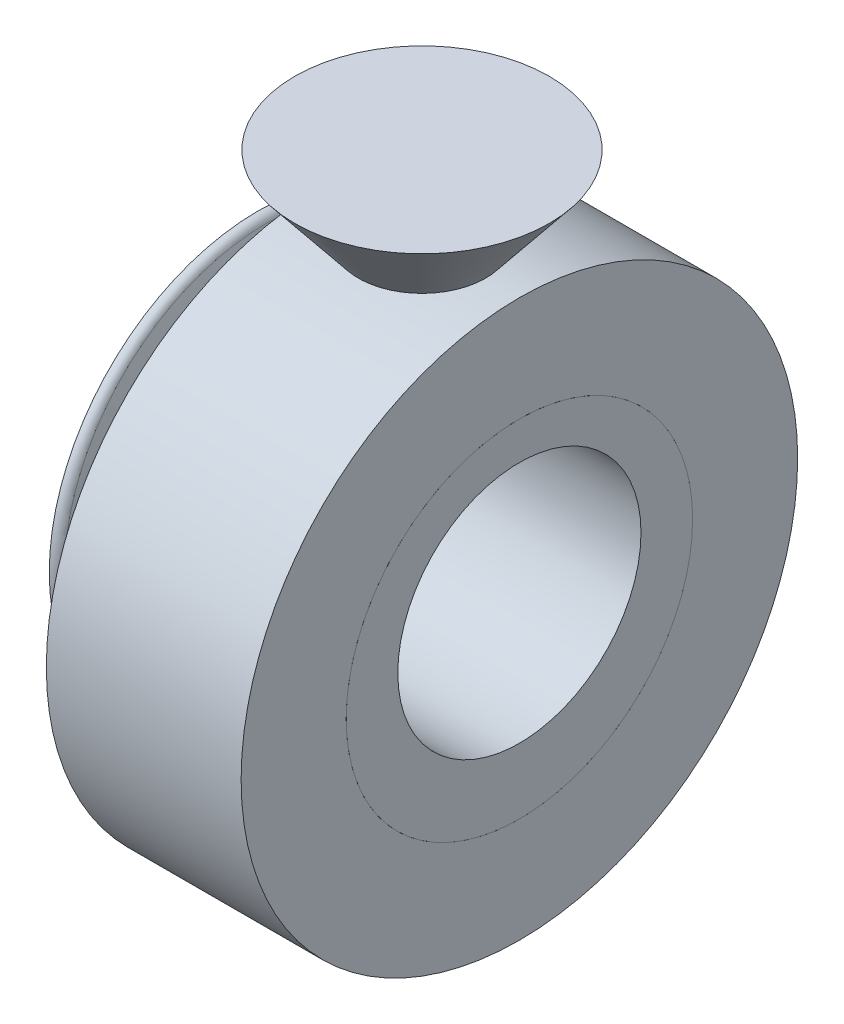
ISO-10303-21;
HEADER;
FILE_DESCRIPTION(('STEP AP214'),'2;1');
FILE_NAME('part.step','',(''),(''),'','','');
FILE_SCHEMA(('AUTOMOTIVE_DESIGN { 1 0 10303 214 1 1 1 1 }'));
ENDSEC;
DATA;
#1=APPLICATION_CONTEXT('core data for automotive mechanical design processes');
#2=APPLICATION_PROTOCOL_DEFINITION('international standard','automotive_design',2000,#1);
#3=PRODUCT_CONTEXT('',#1,'mechanical');
#4=PRODUCT('Part','Part','',(#3));
#5=PRODUCT_RELATED_PRODUCT_CATEGORY('part','',(#4));
#6=PRODUCT_DEFINITION_FORMATION('','',#4);
#7=PRODUCT_DEFINITION_CONTEXT('part definition',#1,'design');
#8=PRODUCT_DEFINITION('design','',#6,#7);
#9=PRODUCT_DEFINITION_SHAPE('','',#8);
#10=(LENGTH_UNIT() NAMED_UNIT(*) SI_UNIT(.MILLI.,.METRE.));
#11=(NAMED_UNIT(*) PLANE_ANGLE_UNIT() SI_UNIT($,.RADIAN.));
#12=(NAMED_UNIT(*) SI_UNIT($,.STERADIAN.) SOLID_ANGLE_UNIT());
#13=UNCERTAINTY_MEASURE_WITH_UNIT(LENGTH_MEASURE(1.E-05),#10,'distance_accuracy_value','');
#14=(GEOMETRIC_REPRESENTATION_CONTEXT(3) GLOBAL_UNCERTAINTY_ASSIGNED_CONTEXT((#13)) GLOBAL_UNIT_ASSIGNED_CONTEXT((#10,
#11,#12)) REPRESENTATION_CONTEXT('',''));
#15=CARTESIAN_POINT('',(0.,0.,0.));
#16=DIRECTION('',(0.,0.,1.));
#17=DIRECTION('',(1.,0.,0.));
#18=AXIS2_PLACEMENT_3D('',#15,#16,#17);
#19=CARTESIAN_POINT('',(14.7029380990123,25.4,0.));
#20=DIRECTION('',(0.,-1.,0.));
#21=DIRECTION('',(0.,0.,-1.));
#22=AXIS2_PLACEMENT_3D('',#19,#20,#21);
#23=PLANE('',#22);
#24=CARTESIAN_POINT('',(8.89,25.4,0.));
#25=DIRECTION('',(0.,-1.,0.));
#26=DIRECTION('',(0.,0.,-1.));
#27=AXIS2_PLACEMENT_3D('',#24,#25,#26);
#28=CIRCLE('',#27,5.81293809901228);
#29=CARTESIAN_POINT('',(8.89,25.4,-5.81293809901228));
#30=VERTEX_POINT('',#29);
#31=EDGE_CURVE('E57',#30,#30,#28,.T.);
#32=ORIENTED_EDGE('',*,*,#31,.T.);
#33=EDGE_LOOP('',(#32));
#34=FACE_BOUND('',#33,.T.);
#35=ADVANCED_FACE('F51',(#34),#23,.T.);
#36=CARTESIAN_POINT('',(8.89,32.639,0.));
#37=DIRECTION('',(0.,1.,0.));
#38=DIRECTION('',(0.,0.,1.));
#39=AXIS2_PLACEMENT_3D('',#36,#37,#38);
#40=PLANE('',#39);
#41=CARTESIAN_POINT('',(8.89,32.639,0.));
#42=DIRECTION('',(0.,-1.,0.));
#43=DIRECTION('',(0.,0.,-1.));
#44=AXIS2_PLACEMENT_3D('',#41,#42,#43);
#45=CIRCLE('',#44,11.6258761980246);
#46=CARTESIAN_POINT('',(8.89,32.639,-11.6258761980246));
#47=VERTEX_POINT('',#46);
#48=EDGE_CURVE('E13',#47,#47,#45,.T.);
#49=ORIENTED_EDGE('',*,*,#48,.F.);
#50=EDGE_LOOP('',(#49));
#51=FACE_BOUND('',#50,.T.);
#52=ADVANCED_FACE('F66',(#51),#40,.T.);
#53=CARTESIAN_POINT('',(8.89,25.4,0.));
#54=DIRECTION('',(0.,1.,0.));
#55=DIRECTION('',(0.,0.,1.));
#56=AXIS2_PLACEMENT_3D('',#53,#54,#55);
#57=CONICAL_SURFACE('',#56,5.81293809901228,0.676569307433863);
#58=ORIENTED_EDGE('',*,*,#48,.T.);
#59=EDGE_LOOP('',(#58));
#60=FACE_BOUND('',#59,.T.);
#61=ORIENTED_EDGE('',*,*,#31,.F.);
#62=EDGE_LOOP('',(#61));
#63=FACE_BOUND('',#62,.T.);
#64=ADVANCED_FACE('F64',(#60,#63),#57,.T.);
#65=CLOSED_SHELL('',(#35,#52,#64));
#66=MANIFOLD_SOLID_BREP('B2',#65);
#67=CARTESIAN_POINT('',(89.6220489685532,0.,0.));
#68=DIRECTION('',(-1.,0.,0.));
#69=DIRECTION('',(0.,-1.,0.));
#70=AXIS2_PLACEMENT_3D('',#67,#68,#69);
#71=CYLINDRICAL_SURFACE('',#70,25.4);
#72=CARTESIAN_POINT('',(0.,0.,0.));
#73=DIRECTION('',(1.,0.,0.));
#74=DIRECTION('',(0.,1.,0.));
#75=AXIS2_PLACEMENT_3D('',#72,#73,#74);
#76=CIRCLE('',#75,25.4);
#77=CARTESIAN_POINT('',(0.,25.4,0.));
#78=VERTEX_POINT('',#77);
#79=EDGE_CURVE('E107',#78,#78,#76,.T.);
#80=ORIENTED_EDGE('',*,*,#79,.T.);
#81=EDGE_LOOP('',(#80));
#82=FACE_BOUND('',#81,.T.);
#83=CARTESIAN_POINT('',(17.78,0.,0.));
#84=DIRECTION('',(1.,0.,0.));
#85=DIRECTION('',(0.,0.,-1.));
#86=AXIS2_PLACEMENT_3D('',#83,#84,#85);
#87=CIRCLE('',#86,25.4);
#88=CARTESIAN_POINT('',(17.78,0.,-25.4));
#89=VERTEX_POINT('',#88);
#90=EDGE_CURVE('E50',#89,#89,#87,.T.);
#91=ORIENTED_EDGE('',*,*,#90,.F.);
#92=EDGE_LOOP('',(#91));
#93=FACE_BOUND('',#92,.T.);
#94=ADVANCED_FACE('F100',(#82,#93),#71,.T.);
#95=CARTESIAN_POINT('',(0.,0.,0.));
#96=DIRECTION('',(1.,0.,0.));
#97=DIRECTION('',(0.,1.,0.));
#98=AXIS2_PLACEMENT_3D('',#95,#96,#97);
#99=PLANE('',#98);
#100=ORIENTED_EDGE('',*,*,#79,.F.);
#101=EDGE_LOOP('',(#100));
#102=FACE_BOUND('',#101,.T.);
#103=CARTESIAN_POINT('',(0.,0.,0.));
#104=DIRECTION('',(1.,0.,0.));
#105=DIRECTION('',(0.,1.,0.));
#106=AXIS2_PLACEMENT_3D('',#103,#104,#105);
#107=CIRCLE('',#106,15.8115);
#108=CARTESIAN_POINT('',(0.,15.8115,0.));
#109=VERTEX_POINT('',#108);
#110=EDGE_CURVE('E112',#109,#109,#107,.T.);
#111=ORIENTED_EDGE('',*,*,#110,.T.);
#112=EDGE_LOOP('',(#111));
#113=FACE_BOUND('',#112,.T.);
#114=ADVANCED_FACE('F128',(#102,#113),#99,.F.);
#115=CARTESIAN_POINT('',(89.6220489685532,0.,0.));
#116=DIRECTION('',(-1.,0.,0.));
#117=DIRECTION('',(0.,-1.,0.));
#118=AXIS2_PLACEMENT_3D('',#115,#116,#117);
#119=CYLINDRICAL_SURFACE('',#118,15.8115);
#120=ORIENTED_EDGE('',*,*,#110,.F.);
#121=EDGE_LOOP('',(#120));
#122=FACE_BOUND('',#121,.T.);
#123=CARTESIAN_POINT('',(17.78,0.,0.));
#124=DIRECTION('',(1.,0.,0.));
#125=DIRECTION('',(0.,0.,-1.));
#126=AXIS2_PLACEMENT_3D('',#123,#124,#125);
#127=CIRCLE('',#126,15.8115);
#128=CARTESIAN_POINT('',(17.78,0.,-15.8115));
#129=VERTEX_POINT('',#128);
#130=EDGE_CURVE('E103',#129,#129,#127,.T.);
#131=ORIENTED_EDGE('',*,*,#130,.T.);
#132=EDGE_LOOP('',(#131));
#133=FACE_BOUND('',#132,.T.);
#134=ADVANCED_FACE('F120',(#122,#133),#119,.F.);
#135=CARTESIAN_POINT('',(17.78,0.,0.));
#136=DIRECTION('',(1.,0.,0.));
#137=DIRECTION('',(0.,0.,-1.));
#138=AXIS2_PLACEMENT_3D('',#135,#136,#137);
#139=PLANE('',#138);
#140=ORIENTED_EDGE('',*,*,#130,.F.);
#141=EDGE_LOOP('',(#140));
#142=FACE_BOUND('',#141,.T.);
#143=ORIENTED_EDGE('',*,*,#90,.T.);
#144=EDGE_LOOP('',(#143));
#145=FACE_BOUND('',#144,.T.);
#146=ADVANCED_FACE('F122',(#142,#145),#139,.T.);
#147=CLOSED_SHELL('',(#94,#114,#134,#146));
#148=MANIFOLD_SOLID_BREP('B8',#147);
#149=CARTESIAN_POINT('',(17.78,0.,0.));
#150=DIRECTION('',(-1.,0.,0.));
#151=DIRECTION('',(0.,0.,1.));
#152=AXIS2_PLACEMENT_3D('',#149,#150,#151);
#153=CYLINDRICAL_SURFACE('',#152,15.8115);
#154=CARTESIAN_POINT('',(17.78,0.,0.));
#155=DIRECTION('',(1.,0.,0.));
#156=DIRECTION('',(0.,0.,-1.));
#157=AXIS2_PLACEMENT_3D('',#154,#155,#156);
#158=CIRCLE('',#157,15.8115);
#159=CARTESIAN_POINT('',(17.78,0.,-15.8115));
#160=VERTEX_POINT('',#159);
#161=EDGE_CURVE('E99',#160,#160,#158,.T.);
#162=ORIENTED_EDGE('',*,*,#161,.F.);
#163=EDGE_LOOP('',(#162));
#164=FACE_BOUND('',#163,.T.);
#165=CARTESIAN_POINT('',(0.,0.,0.));
#166=DIRECTION('',(1.,0.,0.));
#167=DIRECTION('',(0.,1.,0.));
#168=AXIS2_PLACEMENT_3D('',#165,#166,#167);
#169=CIRCLE('',#168,15.8115);
#170=CARTESIAN_POINT('',(0.,15.8115,0.));
#171=VERTEX_POINT('',#170);
#172=EDGE_CURVE('E185',#171,#171,#169,.T.);
#173=ORIENTED_EDGE('',*,*,#172,.T.);
#174=EDGE_LOOP('',(#173));
#175=FACE_BOUND('',#174,.T.);
#176=CARTESIAN_POINT('',(8.89,15.0570002407518,-4.826));
#177=CARTESIAN_POINT('',(8.62578904430855,15.0570025443,-4.82599731123148));
#178=CARTESIAN_POINT('',(8.36155145707475,15.0640306532035,-4.80422896550823));
#179=CARTESIAN_POINT('',(7.84081709460603,15.0912664921545,-4.71796526899775));
#180=CARTESIAN_POINT('',(7.58432272462476,15.1114782742187,-4.65345678188426));
#181=CARTESIAN_POINT('',(7.08669035580407,15.1625836399864,-4.48411972780117));
#182=CARTESIAN_POINT('',(6.84552695918621,15.1934589815602,-4.37935998436834));
#183=CARTESIAN_POINT('',(6.38413591797069,15.2623876314115,-4.13272178684231));
#184=CARTESIAN_POINT('',(6.16391165163785,15.3004420950044,-3.99083735695634));
#185=CARTESIAN_POINT('',(5.74343499777729,15.3808395316536,-3.66899986784806));
#186=CARTESIAN_POINT('',(5.5439698313722,15.423276293626,-3.48804150570192));
#187=CARTESIAN_POINT('',(5.17769370171334,15.5068568885206,-3.09534594476635));
#188=CARTESIAN_POINT('',(5.01088708300657,15.548000548812,-2.8836046574627));
#189=CARTESIAN_POINT('',(4.71122179052056,15.6254275998323,-2.42973014431403));
#190=CARTESIAN_POINT('',(4.57916910482938,15.6615876371726,-2.18704188657756));
#191=CARTESIAN_POINT('',(4.35805812539982,15.7238812187247,-1.68161081980742));
#192=CARTESIAN_POINT('',(4.26899021619452,15.7500170050396,-1.41887251110768));
#193=CARTESIAN_POINT('',(4.13899189374515,15.7886535727825,-0.889038149215126));
#194=CARTESIAN_POINT('',(4.096717028754,15.8015343799545,-0.622300181233234));
#195=CARTESIAN_POINT('',(4.05725008966759,15.8135495840235,-0.0852271876124858));
#196=CARTESIAN_POINT('',(4.06004822499625,15.8126869662125,0.185107044113392));
#197=CARTESIAN_POINT('',(4.10975285721414,15.7975794808771,0.71225420265103));
#198=CARTESIAN_POINT('',(4.15520280203186,15.7837765386023,0.969219139983619));
#199=CARTESIAN_POINT('',(4.28653721085521,15.744879071765,1.4716832372719));
#200=CARTESIAN_POINT('',(4.37242426872541,15.7197838228548,1.71718166059011));
#201=CARTESIAN_POINT('',(4.5831602193171,15.6605178589191,2.19316419763153));
#202=CARTESIAN_POINT('',(4.70846053661193,15.6262427130874,2.42343490925521));
#203=CARTESIAN_POINT('',(4.9941070381985,15.5522424907992,2.86014242377882));
#204=CARTESIAN_POINT('',(5.15446176690171,15.5125160864948,3.06657339703032));
#205=CARTESIAN_POINT('',(5.51318808180492,15.4299871691106,3.45843127805195));
#206=CARTESIAN_POINT('',(5.71281981090112,15.3871251588725,3.64269362682461));
#207=CARTESIAN_POINT('',(6.14056103738859,15.3045323328543,3.97546162440061));
#208=CARTESIAN_POINT('',(6.36867357157614,15.2648018517149,4.12396345524793));
#209=CARTESIAN_POINT('',(6.85005967423271,15.1926795901892,4.38226700946222));
#210=CARTESIAN_POINT('',(7.10356680804782,15.1603670587727,4.49165720688537));
#211=CARTESIAN_POINT('',(7.62662322411664,15.1076749283427,4.66584044252478));
#212=CARTESIAN_POINT('',(7.89616702167752,15.0872912750911,4.73064863403186));
#213=CARTESIAN_POINT('',(8.43253122631193,15.0616588090028,4.81162256473183));
#214=CARTESIAN_POINT('',(8.69905737227334,15.0558578343074,4.82956396008669));
#215=CARTESIAN_POINT('',(9.23132393376028,15.0585181268259,4.82126447425837));
#216=CARTESIAN_POINT('',(9.4970644582625,15.0669773130582,4.79503003964333));
#217=CARTESIAN_POINT('',(10.0127121250415,15.0966615234332,4.70070726787124));
#218=CARTESIAN_POINT('',(10.2628532985958,15.1175333571601,4.63377578828364));
#219=CARTESIAN_POINT('',(10.7483336526711,15.1693217812082,4.46130721818876));
#220=CARTESIAN_POINT('',(10.9836704868338,15.2002399590235,4.35576402603879));
#221=CARTESIAN_POINT('',(11.4400488503735,15.2696978919978,4.10573851868089));
#222=CARTESIAN_POINT('',(11.6605163426418,15.3084244973891,3.9602616195349));
#223=CARTESIAN_POINT('',(12.0745580147637,15.3887404460762,3.63567106932027));
#224=CARTESIAN_POINT('',(12.2681255092833,15.4303304971843,3.456549082509));
#225=CARTESIAN_POINT('',(12.6307066844073,15.5136632075484,3.06138286756688));
#226=CARTESIAN_POINT('',(12.7984579983036,15.5553477511897,2.84416514470762));
#227=CARTESIAN_POINT('',(13.0951673975026,15.6325335824006,2.38366298355078));
#228=CARTESIAN_POINT('',(13.2241273542942,15.6680351682321,2.1403798035493));
#229=CARTESIAN_POINT('',(13.4383500044748,15.7286434633609,1.63621980790409));
#230=CARTESIAN_POINT('',(13.5239356473349,15.7538267214868,1.37548988869954));
#231=CARTESIAN_POINT('',(13.6497803046827,15.7912984871859,0.842438118074745));
#232=CARTESIAN_POINT('',(13.6900527872657,15.8035908261576,0.570119735995014));
#233=CARTESIAN_POINT('',(13.7230746617113,15.8136539501311,0.0332680846376172));
#234=CARTESIAN_POINT('',(13.7176516815409,15.8119832220904,-0.231143668236388));
#235=CARTESIAN_POINT('',(13.6638265495006,15.7956330945904,-0.755121904463467));
#236=CARTESIAN_POINT('',(13.6154269831494,15.7809544777002,-1.01468867833668));
#237=CARTESIAN_POINT('',(13.4781675000908,15.7404044021089,-1.51870237040572));
#238=CARTESIAN_POINT('',(13.3897773754605,15.714663074597,-1.76328841988841));
#239=CARTESIAN_POINT('',(13.175467614881,15.6546460437501,-2.23428265138367));
#240=CARTESIAN_POINT('',(13.0495416938542,15.6203689113191,-2.46068778107696));
#241=CARTESIAN_POINT('',(12.7589498067897,15.5454726933216,-2.89697028000788));
#242=CARTESIAN_POINT('',(12.5931484219201,15.504682438656,-3.10606173494552));
#243=CARTESIAN_POINT('',(12.2295393027957,15.4218834136727,-3.49406353873724));
#244=CARTESIAN_POINT('',(12.0317222034717,15.3798742897776,-3.67296502520673));
#245=CARTESIAN_POINT('',(11.602301390258,15.2978469444285,-4.00111990536269));
#246=CARTESIAN_POINT('',(11.3698367904032,15.2579315834474,-4.14927544771118));
#247=CARTESIAN_POINT('',(10.8821285146302,15.1863043000761,-4.4042402254757));
#248=CARTESIAN_POINT('',(10.6268951429487,15.1545886918843,-4.51106804852203));
#249=CARTESIAN_POINT('',(10.1267939788219,15.1058671798706,-4.67147041407588));
#250=CARTESIAN_POINT('',(9.88338288635087,15.0877197922723,-4.72925504081984));
#251=CARTESIAN_POINT('',(9.38998817840539,15.0632865291926,-4.80651691930125));
#252=CARTESIAN_POINT('',(9.14000601165471,15.0569980610508,-4.82600254421052));
#253=CARTESIAN_POINT('',(8.89,15.0570002407518,-4.826));
#254=B_SPLINE_CURVE_WITH_KNOTS('',3,(#176,#177,#178,#179,#180,#181,#182,#183,#184,#185,#186,
#187,#188,#189,#190,#191,#192,#193,#194,#195,#196,#197,#198,#199,#200,#201,#202,#203,#204,#205,
#206,#207,#208,#209,#210,#211,#212,#213,#214,#215,#216,#217,#218,#219,#220,#221,#222,#223,#224,
#225,#226,#227,#228,#229,#230,#231,#232,#233,#234,#235,#236,#237,#238,#239,#240,#241,#242,#243,
#244,#245,#246,#247,#248,#249,#250,#251,#252,#253),.UNSPECIFIED.,.T.,.F.,(4,2,2,2,2,2,2,2,2,2,2,
2,2,2,2,2,2,2,2,2,2,2,2,2,2,2,2,2,2,2,2,2,2,2,2,2,2,2,4),(0.,0.791710107714534,1.5836636631457,
2.37426908130395,3.16500183801081,3.9792145416667,4.79353548606426,5.62534454366734,
6.45696744364251,7.26402048277123,8.07089821944496,8.85118671846215,9.6315252764063,
10.4211486204282,11.2109646478895,12.032249149667,12.8536212966875,13.6833977081579,
14.5128919415598,15.3104699585785,16.1079315953171,16.8837202931083,17.6596316384398,
18.4569642932339,19.2544947524599,20.0833368429479,20.9121389395371,21.7346759139524,
22.5569683471557,23.3465335010741,24.1360511570992,24.9165254977288,25.6971305962057,
26.5033452148774,27.3097960908861,28.1413821662243,28.9725937898583,29.7219025132468,
30.4710473997578),.UNSPECIFIED.);
#255=CARTESIAN_POINT('',(8.89,15.0570002407518,-4.826));
#256=VERTEX_POINT('',#255);
#257=EDGE_CURVE('E213',#256,#256,#254,.T.);
#258=ORIENTED_EDGE('',*,*,#257,.F.);
#259=EDGE_LOOP('',(#258));
#260=FACE_BOUND('',#259,.T.);
#261=ADVANCED_FACE('F165',(#164,#175,#260),#153,.T.);
#262=CARTESIAN_POINT('',(17.78,1.27,0.));
#263=DIRECTION('',(-1.,0.,0.));
#264=DIRECTION('',(0.,0.,1.));
#265=AXIS2_PLACEMENT_3D('',#262,#263,#264);
#266=CYLINDRICAL_SURFACE('',#265,11.1);
#267=CARTESIAN_POINT('',(0.,1.27,0.));
#268=DIRECTION('',(1.,0.,0.));
#269=DIRECTION('',(0.,0.,-1.));
#270=AXIS2_PLACEMENT_3D('',#267,#268,#269);
#271=CIRCLE('',#270,11.1);
#272=CARTESIAN_POINT('',(0.,1.27,-11.1));
#273=VERTEX_POINT('',#272);
#274=EDGE_CURVE('E181',#273,#273,#271,.T.);
#275=ORIENTED_EDGE('',*,*,#274,.F.);
#276=EDGE_LOOP('',(#275));
#277=FACE_BOUND('',#276,.T.);
#278=CARTESIAN_POINT('',(17.78,1.27,0.));
#279=DIRECTION('',(1.,0.,0.));
#280=DIRECTION('',(0.,0.,-1.));
#281=AXIS2_PLACEMENT_3D('',#278,#279,#280);
#282=CIRCLE('',#281,11.1);
#283=CARTESIAN_POINT('',(17.78,1.27,-11.1));
#284=VERTEX_POINT('',#283);
#285=EDGE_CURVE('E177',#284,#284,#282,.T.);
#286=ORIENTED_EDGE('',*,*,#285,.T.);
#287=EDGE_LOOP('',(#286));
#288=FACE_BOUND('',#287,.T.);
#289=CARTESIAN_POINT('',(8.89,11.265985394147,-4.826));
#290=CARTESIAN_POINT('',(8.76183437688351,11.2659864804772,-4.82599900419528));
#291=CARTESIAN_POINT('',(8.63362995171321,11.268458894206,-4.82088705266793));
#292=CARTESIAN_POINT('',(8.37816411409077,11.2782658838139,-4.80049349581554));
#293=CARTESIAN_POINT('',(8.25090333098093,11.2856034529574,-4.78520562978351));
#294=CARTESIAN_POINT('',(7.99808186611001,11.304905325332,-4.74459487860435));
#295=CARTESIAN_POINT('',(7.87252515701238,11.3168789844339,-4.71925169873639));
#296=CARTESIAN_POINT('',(7.6242227535809,11.3450527344782,-4.65880054589495));
#297=CARTESIAN_POINT('',(7.50147827255033,11.361254613629,-4.62368844100936));
#298=CARTESIAN_POINT('',(7.26022103666074,11.3972773488085,-4.54424291544667));
#299=CARTESIAN_POINT('',(7.14169084705597,11.4170805216122,-4.49995441120005));
#300=CARTESIAN_POINT('',(6.9089196846136,11.4597639187604,-4.40244741130501));
#301=CARTESIAN_POINT('',(6.79468035076831,11.4826453039129,-4.34922554496012));
#302=CARTESIAN_POINT('',(6.45947883938259,11.5549240033202,-4.17682438457202));
#303=CARTESIAN_POINT('',(6.24574513488443,11.6080013634065,-4.04481384321978));
#304=CARTESIAN_POINT('',(5.82966004548386,11.7219273828902,-3.74100365876819));
#305=CARTESIAN_POINT('',(5.62882100211126,11.7830533544964,-3.56725382582977));
#306=CARTESIAN_POINT('',(5.25790198240998,11.9039597679853,-3.18876836862062));
#307=CARTESIAN_POINT('',(5.08783449553941,11.9637396549432,-2.98402022450813));
#308=CARTESIAN_POINT('',(4.855534152574,12.0491993054868,-2.65195296497164));
#309=CARTESIAN_POINT('',(4.78047295577566,12.077579657027,-2.5340984727433));
#310=CARTESIAN_POINT('',(4.64062207276904,12.1315271156572,-2.29185342311229));
#311=CARTESIAN_POINT('',(4.5758280880388,12.1570953986829,-2.16746563017003));
#312=CARTESIAN_POINT('',(4.45709797791998,12.2046872603534,-1.91295121104126));
#313=CARTESIAN_POINT('',(4.40316265368438,12.2267105774263,-1.78282416227473));
#314=CARTESIAN_POINT('',(4.30673578898083,12.2665497331158,-1.51783664294457));
#315=CARTESIAN_POINT('',(4.26423839688219,12.2843677225958,-1.38297863280494));
#316=CARTESIAN_POINT('',(4.19318194156243,12.3144034131474,-1.11715620701723));
#317=CARTESIAN_POINT('',(4.16397882114261,12.3268775894646,-0.986392758035701));
#318=CARTESIAN_POINT('',(4.11652338850346,12.347244355401,-0.722596925132271));
#319=CARTESIAN_POINT('',(4.09826610507337,12.3551390248166,-0.589565599475197));
#320=CARTESIAN_POINT('',(4.07290137709708,12.3661269075161,-0.322268620961884));
#321=CARTESIAN_POINT('',(4.06579207269996,12.3692209217067,-0.188003177757568));
#322=CARTESIAN_POINT('',(4.06280469488494,12.3705196253073,0.080673566322792));
#323=CARTESIAN_POINT('',(4.06692613909711,12.3687245247087,0.215084860686546));
#324=CARTESIAN_POINT('',(4.08570166079388,12.3605789966521,0.47403609782302));
#325=CARTESIAN_POINT('',(4.09963785882019,12.3545391050983,0.598638638413677));
#326=CARTESIAN_POINT('',(4.13711071719798,12.3383962250482,0.846164552807512));
#327=CARTESIAN_POINT('',(4.16065053585003,12.3282918999149,0.969087360446913));
#328=CARTESIAN_POINT('',(4.21709118406126,12.3042714817111,1.21234410561761));
#329=CARTESIAN_POINT('',(4.24998890296686,12.290356655344,1.33267888915909));
#330=CARTESIAN_POINT('',(4.32483541767512,12.2590539523091,1.570051675411));
#331=CARTESIAN_POINT('',(4.36678766153912,12.2416647527502,1.68708840293698));
#332=CARTESIAN_POINT('',(4.50709703077507,12.1843081460264,2.03559685026189));
#333=CARTESIAN_POINT('',(4.61908855935053,12.1395137459825,2.26096030095774));
#334=CARTESIAN_POINT('',(4.87553759440991,12.0413345694333,2.69016930012509));
#335=CARTESIAN_POINT('',(5.02000684267641,11.9879466880843,2.89400702705656));
#336=CARTESIAN_POINT('',(5.35001311967698,11.8730891478787,3.29094681178253));
#337=CARTESIAN_POINT('',(5.53783245582938,11.8113136375327,3.48206514823165));
#338=CARTESIAN_POINT('',(5.9430089273204,11.6895617124228,3.83105352108528));
#339=CARTESIAN_POINT('',(6.16037948183633,11.6295861301965,3.98890836904922));
#340=CARTESIAN_POINT('',(6.50924686338087,11.5449344591048,4.20021340073613));
#341=CARTESIAN_POINT('',(6.63186095332839,11.5171366072633,4.2674004066092));
#342=CARTESIAN_POINT('',(6.88299661152985,11.4647404096641,4.39110200598937));
#343=CARTESIAN_POINT('',(7.01151571070546,11.4401407428242,4.44762101054116));
#344=CARTESIAN_POINT('',(7.27356063958702,11.3950160024346,4.54941253843556));
#345=CARTESIAN_POINT('',(7.40708433842837,11.3744892176413,4.59468978708143));
#346=CARTESIAN_POINT('',(7.67819241221535,11.3382753274326,4.67351233690092));
#347=CARTESIAN_POINT('',(7.81577638462304,11.3225877440101,4.707058796863));
#348=CARTESIAN_POINT('',(8.08429377248596,11.2975751577779,4.76009823757861));
#349=CARTESIAN_POINT('',(8.21503415061747,11.2878868882815,4.78039880778099));
#350=CARTESIAN_POINT('',(8.47801289567387,11.2736106265704,4.81020269978777));
#351=CARTESIAN_POINT('',(8.61025114699498,11.2690222434267,4.81970684918727));
#352=CARTESIAN_POINT('',(8.87509517661823,11.2651198183644,4.82779454820931));
#353=CARTESIAN_POINT('',(9.00770081868347,11.2658040300145,4.82638171384276));
#354=CARTESIAN_POINT('',(9.27221029379913,11.2724160689229,4.81266351271186));
#355=CARTESIAN_POINT('',(9.40411415181836,11.278343708353,4.80035853612213));
#356=CARTESIAN_POINT('',(9.65661328197746,11.294605857834,4.76629887638556));
#357=CARTESIAN_POINT('',(9.77733332110847,11.3045885138482,4.74529653210809));
#358=CARTESIAN_POINT('',(10.0164628592334,11.3285513860995,4.69428656022124));
#359=CARTESIAN_POINT('',(10.134871608506,11.3425328771684,4.66427606065324));
#360=CARTESIAN_POINT('',(10.4854625070315,11.3898714092049,4.5611411237001));
#361=CARTESIAN_POINT('',(10.713195884242,11.4286355173238,4.47488764282112));
#362=CARTESIAN_POINT('',(11.1610619988093,11.5182686370137,4.26572320515869));
#363=CARTESIAN_POINT('',(11.3804191706088,11.5695952942558,4.1413660479452));
#364=CARTESIAN_POINT('',(11.7962778367337,11.6779693755169,3.86093146358144));
#365=CARTESIAN_POINT('',(11.9927687927426,11.7350194148856,3.70483950118162));
#366=CARTESIAN_POINT('',(12.3758277552924,11.8546420074533,3.34866947234781));
#367=CARTESIAN_POINT('',(12.5599055736504,11.917248899817,3.14589505911847));
#368=CARTESIAN_POINT('',(12.8087908694413,12.0064174272745,2.81995072330714));
#369=CARTESIAN_POINT('',(12.8872542475739,12.0353664427972,2.70759572864481));
#370=CARTESIAN_POINT('',(13.0345612284331,12.0909267834258,2.47621992958854));
#371=CARTESIAN_POINT('',(13.1034089820267,12.1175391153763,2.35720203270797));
#372=CARTESIAN_POINT('',(13.2313502092041,12.1678696102685,2.11238409399499));
#373=CARTESIAN_POINT('',(13.2903742076122,12.1915668737125,1.98654345505372));
#374=CARTESIAN_POINT('',(13.3975136540159,12.2351725398311,1.72972320014359));
#375=CARTESIAN_POINT('',(13.4456338490947,12.2550825906992,1.59874584974222));
#376=CARTESIAN_POINT('',(13.5304656027084,12.2905335370188,1.33261200636784));
#377=CARTESIAN_POINT('',(13.5671807150028,12.3060757933062,1.19745682964363));
#378=CARTESIAN_POINT('',(13.6287867095985,12.3323254733371,0.924019415719506));
#379=CARTESIAN_POINT('',(13.653678578906,12.3430333006557,0.785737440555184));
#380=CARTESIAN_POINT('',(13.6899114646469,12.35867124734,0.517704326241002));
#381=CARTESIAN_POINT('',(13.702130173157,12.3639750559905,0.388092949006358));
#382=CARTESIAN_POINT('',(13.7160540098466,12.3700216625998,0.128152782318848));
#383=CARTESIAN_POINT('',(13.7177556140593,12.3707629317879,-0.0021762329542108));
#384=CARTESIAN_POINT('',(13.7106170664341,12.3676602415296,-0.262415194215753));
#385=CARTESIAN_POINT('',(13.7017828787275,12.3638188762336,-0.392325335595332));
#386=CARTESIAN_POINT('',(13.6736794170839,12.3516584054608,-0.650846430393206));
#387=CARTESIAN_POINT('',(13.6544062648572,12.3433376358003,-0.779456882849279));
#388=CARTESIAN_POINT('',(13.6066470879338,12.3228746001731,-1.02906760282245));
#389=CARTESIAN_POINT('',(13.5785776208964,12.3109056866852,-1.15016190054807));
#390=CARTESIAN_POINT('',(13.5133189546227,12.2833527193675,-1.38946133565004));
#391=CARTESIAN_POINT('',(13.476126588098,12.267767410099,-1.50766545390698));
#392=CARTESIAN_POINT('',(13.3513501016248,12.216120489587,-1.85676781324442));
#393=CARTESIAN_POINT('',(13.2505267527762,12.1751501242345,-2.08236169864514));
#394=CARTESIAN_POINT('',(13.0114405563711,12.0817245441786,-2.52388068463162));
#395=CARTESIAN_POINT('',(12.8716756516494,12.0288295881801,-2.73889100945261));
#396=CARTESIAN_POINT('',(12.5607893779512,11.9176908441569,-3.14336051689959));
#397=CARTESIAN_POINT('',(12.3896552427207,11.859444883279,-3.33280924209401));
#398=CARTESIAN_POINT('',(12.0056394618647,11.7385907079809,-3.69565642435947));
#399=CARTESIAN_POINT('',(11.7905888759683,11.6759830959976,-3.86678406067738));
#400=CARTESIAN_POINT('',(11.4477405157096,11.5874376694325,-4.09477327892134));
#401=CARTESIAN_POINT('',(11.3299670401395,11.5587941540246,-4.1660357276777));
#402=CARTESIAN_POINT('',(11.0882994441196,11.5041786316759,-4.2984541002196));
#403=CARTESIAN_POINT('',(10.9644081356857,11.4782054139646,-4.35961461213972));
#404=CARTESIAN_POINT('',(10.711146182606,11.4297655069453,-4.47134006894223));
#405=CARTESIAN_POINT('',(10.5817708976567,11.4073018657505,-4.52189581635996));
#406=CARTESIAN_POINT('',(10.3185823151146,11.366716523222,-4.61180550563004));
#407=CARTESIAN_POINT('',(10.1847712617321,11.3485926632869,-4.6511650183136));
#408=CARTESIAN_POINT('',(9.91404913927546,11.3174060431061,-4.71815598515056));
#409=CARTESIAN_POINT('',(9.7771472398668,11.3043299787561,-4.74581828741767));
#410=CARTESIAN_POINT('',(9.5011227437389,11.2837050599903,-4.78918517809987));
#411=CARTESIAN_POINT('',(9.36200191817753,11.2761520025775,-4.80489885975519));
#412=CARTESIAN_POINT('',(9.16711808740513,11.2696725827247,-4.81835653129501));
#413=CARTESIAN_POINT('',(9.11174560767658,11.2682910856912,-4.82122178964389));
#414=CARTESIAN_POINT('',(9.00091784181953,11.2664472470813,-4.82504375871002));
#415=CARTESIAN_POINT('',(8.94546255404314,11.2659849240471,-4.82600043092579));
#416=CARTESIAN_POINT('',(8.89,11.265985394147,-4.826));
#417=B_SPLINE_CURVE_WITH_KNOTS('',3,(#289,#290,#291,#292,#293,#294,#295,#296,#297,#298,#299,
#300,#301,#302,#303,#304,#305,#306,#307,#308,#309,#310,#311,#312,#313,#314,#315,#316,#317,#318,
#319,#320,#321,#322,#323,#324,#325,#326,#327,#328,#329,#330,#331,#332,#333,#334,#335,#336,#337,
#338,#339,#340,#341,#342,#343,#344,#345,#346,#347,#348,#349,#350,#351,#352,#353,#354,#355,#356,
#357,#358,#359,#360,#361,#362,#363,#364,#365,#366,#367,#368,#369,#370,#371,#372,#373,#374,#375,
#376,#377,#378,#379,#380,#381,#382,#383,#384,#385,#386,#387,#388,#389,#390,#391,#392,#393,#394,
#395,#396,#397,#398,#399,#400,#401,#402,#403,#404,#405,#406,#407,#408,#409,#410,#411,#412,#413,
#414,#415,#416),.UNSPECIFIED.,.T.,.F.,(4,2,2,2,2,2,2,2,2,2,2,2,2,2,2,2,2,2,2,2,2,2,2,2,2,2,2,2,
2,2,2,2,2,2,2,2,2,2,2,2,2,2,2,2,2,2,2,2,2,2,2,2,2,2,2,2,2,2,2,2,2,2,2,4),(0.,0.384439300793499,
0.769115345840263,1.15457176762182,1.54019147243315,1.92396645097105,2.3078865606324,
3.07481658056103,3.88899285058256,4.70349883812105,5.13078696769407,5.55789573133728,
5.98503599556667,6.41195731823199,6.81512045415536,7.21810034870877,7.62101300575751,
8.023908357648,8.40003904682805,8.77629353229661,9.15242309311813,9.52869614167891,
10.2919713070423,11.055522866974,11.8769292489684,12.6987098844628,13.1259023461337,
13.5529177818702,13.9797534230546,14.4065468887255,14.8039995606967,15.2014217640443,
15.5987123356675,15.995988676259,16.3643720750951,16.7328730460197,17.4693153956626,
18.2381677513273,19.007373055113,19.8459009765462,20.2656857977667,20.6852888426984,
21.107743718462,21.530014319251,21.9521532106137,22.3742568555614,22.7646427301797,
23.1551594043332,23.54545511858,23.9358959352599,24.3100962614937,24.6844266869397,
25.4324643279315,26.2147307803778,26.9973162994462,27.8386203952897,28.2600104561885,
28.681208599177,29.1027705486755,29.5241223762179,29.9443559695309,30.3642694321606,
30.5306288261041,30.6969915759437),.UNSPECIFIED.);
#418=CARTESIAN_POINT('',(8.89,11.265985394147,-4.826));
#419=VERTEX_POINT('',#418);
#420=EDGE_CURVE('E169',#419,#419,#417,.T.);
#421=ORIENTED_EDGE('',*,*,#420,.T.);
#422=EDGE_LOOP('',(#421));
#423=FACE_BOUND('',#422,.T.);
#424=ADVANCED_FACE('F255',(#277,#288,#423),#266,.F.);
#425=CARTESIAN_POINT('',(17.78,0.,0.));
#426=DIRECTION('',(1.,0.,0.));
#427=DIRECTION('',(0.,0.,-1.));
#428=AXIS2_PLACEMENT_3D('',#425,#426,#427);
#429=PLANE('',#428);
#430=ORIENTED_EDGE('',*,*,#161,.T.);
#431=EDGE_LOOP('',(#430));
#432=FACE_BOUND('',#431,.T.);
#433=ORIENTED_EDGE('',*,*,#285,.F.);
#434=EDGE_LOOP('',(#433));
#435=FACE_BOUND('',#434,.T.);
#436=ADVANCED_FACE('F258',(#432,#435),#429,.T.);
#437=CARTESIAN_POINT('',(0.,10.27,0.));
#438=DIRECTION('',(1.,0.,0.));
#439=DIRECTION('',(0.,1.,0.));
#440=AXIS2_PLACEMENT_3D('',#437,#438,#439);
#441=PLANE('',#440);
#442=CARTESIAN_POINT('',(0.,1.27,0.));
#443=DIRECTION('',(1.,0.,0.));
#444=DIRECTION('',(0.,1.,0.));
#445=AXIS2_PLACEMENT_3D('',#442,#443,#444);
#446=CIRCLE('',#445,9.);
#447=CARTESIAN_POINT('',(0.,10.27,0.));
#448=VERTEX_POINT('',#447);
#449=EDGE_CURVE('E210',#448,#448,#446,.T.);
#450=ORIENTED_EDGE('',*,*,#449,.F.);
#451=EDGE_LOOP('',(#450));
#452=FACE_BOUND('',#451,.T.);
#453=ORIENTED_EDGE('',*,*,#274,.T.);
#454=EDGE_LOOP('',(#453));
#455=FACE_BOUND('',#454,.T.);
#456=ADVANCED_FACE('F228',(#452,#455),#441,.T.);
#457=CARTESIAN_POINT('',(8.89,1.27,0.));
#458=DIRECTION('',(1.,0.,0.));
#459=DIRECTION('',(0.,1.,0.));
#460=AXIS2_PLACEMENT_3D('',#457,#458,#459);
#461=CYLINDRICAL_SURFACE('',#460,9.);
#462=ORIENTED_EDGE('',*,*,#449,.T.);
#463=EDGE_LOOP('',(#462));
#464=FACE_BOUND('',#463,.T.);
#465=CARTESIAN_POINT('',(-6.0833932514932,1.27,0.));
#466=DIRECTION('',(1.,0.,0.));
#467=DIRECTION('',(0.,1.,0.));
#468=AXIS2_PLACEMENT_3D('',#465,#466,#467);
#469=CIRCLE('',#468,9.);
#470=CARTESIAN_POINT('',(-6.0833932514932,10.27,0.));
#471=VERTEX_POINT('',#470);
#472=EDGE_CURVE('E189',#471,#471,#469,.T.);
#473=ORIENTED_EDGE('',*,*,#472,.F.);
#474=EDGE_LOOP('',(#473));
#475=FACE_BOUND('',#474,.T.);
#476=ADVANCED_FACE('F251',(#464,#475),#461,.F.);
#477=CARTESIAN_POINT('',(-6.0833932514932,20.32,0.));
#478=DIRECTION('',(-1.,0.,0.));
#479=DIRECTION('',(0.,-1.,0.));
#480=AXIS2_PLACEMENT_3D('',#477,#478,#479);
#481=PLANE('',#480);
#482=ORIENTED_EDGE('',*,*,#472,.T.);
#483=EDGE_LOOP('',(#482));
#484=FACE_BOUND('',#483,.T.);
#485=CARTESIAN_POINT('',(-6.0833932514932,1.27,0.));
#486=DIRECTION('',(1.,0.,0.));
#487=DIRECTION('',(0.,1.,0.));
#488=AXIS2_PLACEMENT_3D('',#485,#486,#487);
#489=CIRCLE('',#488,19.05);
#490=CARTESIAN_POINT('',(-6.08339325149321,20.32,0.));
#491=VERTEX_POINT('',#490);
#492=EDGE_CURVE('E192',#491,#491,#489,.T.);
#493=ORIENTED_EDGE('',*,*,#492,.F.);
#494=EDGE_LOOP('',(#493));
#495=FACE_BOUND('',#494,.T.);
#496=ADVANCED_FACE('F247',(#484,#495),#481,.T.);
#497=CARTESIAN_POINT('',(-6.0833932514932,1.27,0.));
#498=DIRECTION('',(1.,0.,0.));
#499=DIRECTION('',(0.,1.,0.));
#500=AXIS2_PLACEMENT_3D('',#497,#498,#499);
#501=TOROIDAL_SURFACE('',#500,18.25,0.799999999999999);
#502=ORIENTED_EDGE('',*,*,#492,.T.);
#503=EDGE_LOOP('',(#502));
#504=FACE_BOUND('',#503,.T.);
#505=CARTESIAN_POINT('',(-5.31065259046195,1.27,0.));
#506=DIRECTION('',(1.,0.,0.));
#507=DIRECTION('',(0.,1.,0.));
#508=AXIS2_PLACEMENT_3D('',#505,#506,#507);
#509=CIRCLE('',#508,18.457055236082);
#510=CARTESIAN_POINT('',(-5.31065259046195,19.727055236082,0.));
#511=VERTEX_POINT('',#510);
#512=EDGE_CURVE('E195',#511,#511,#509,.T.);
#513=ORIENTED_EDGE('',*,*,#512,.F.);
#514=EDGE_LOOP('',(#513));
#515=FACE_BOUND('',#514,.T.);
#516=ADVANCED_FACE('F243',(#504,#515),#501,.T.);
#517=CARTESIAN_POINT('',(-4.60887253770052,1.27,0.));
#518=DIRECTION('',(-1.,0.,0.));
#519=DIRECTION('',(0.,-1.,0.));
#520=AXIS2_PLACEMENT_3D('',#517,#518,#519);
#521=CONICAL_SURFACE('',#520,15.837976423438,1.30899693899575);
#522=ORIENTED_EDGE('',*,*,#512,.T.);
#523=EDGE_LOOP('',(#522));
#524=FACE_BOUND('',#523,.T.);
#525=CARTESIAN_POINT('',(-4.60887253770052,1.27,0.));
#526=DIRECTION('',(1.,0.,0.));
#527=DIRECTION('',(0.,1.,0.));
#528=AXIS2_PLACEMENT_3D('',#525,#526,#527);
#529=CIRCLE('',#528,15.837976423438);
#530=CARTESIAN_POINT('',(-4.60887253770052,17.107976423438,0.));
#531=VERTEX_POINT('',#530);
#532=EDGE_CURVE('E198',#531,#531,#529,.T.);
#533=ORIENTED_EDGE('',*,*,#532,.F.);
#534=EDGE_LOOP('',(#533));
#535=FACE_BOUND('',#534,.T.);
#536=ADVANCED_FACE('F239',(#524,#535),#521,.T.);
#537=CARTESIAN_POINT('',(-3.88442816798372,1.27,0.));
#538=DIRECTION('',(1.,0.,0.));
#539=DIRECTION('',(0.,1.,0.));
#540=AXIS2_PLACEMENT_3D('',#537,#538,#539);
#541=TOROIDAL_SURFACE('',#540,16.0320907072649,0.749999999999998);
#542=ORIENTED_EDGE('',*,*,#532,.T.);
#543=EDGE_LOOP('',(#542));
#544=FACE_BOUND('',#543,.T.);
#545=CARTESIAN_POINT('',(-3.30989483564449,1.27,0.));
#546=DIRECTION('',(1.,0.,0.));
#547=DIRECTION('',(0.,1.,0.));
#548=AXIS2_PLACEMENT_3D('',#545,#546,#547);
#549=CIRCLE('',#548,15.55);
#550=CARTESIAN_POINT('',(-3.30989483564449,16.82,0.));
#551=VERTEX_POINT('',#550);
#552=EDGE_CURVE('E201',#551,#551,#549,.T.);
#553=ORIENTED_EDGE('',*,*,#552,.F.);
#554=EDGE_LOOP('',(#553));
#555=FACE_BOUND('',#554,.T.);
#556=ADVANCED_FACE('F235',(#544,#555),#541,.F.);
#557=CARTESIAN_POINT('',(-0.61283555449518,1.27,0.));
#558=DIRECTION('',(1.,0.,0.));
#559=DIRECTION('',(0.,1.,0.));
#560=AXIS2_PLACEMENT_3D('',#557,#558,#559);
#561=CONICAL_SURFACE('',#560,18.7642300877492,0.872664625997162);
#562=ORIENTED_EDGE('',*,*,#552,.T.);
#563=EDGE_LOOP('',(#562));
#564=FACE_BOUND('',#563,.T.);
#565=CARTESIAN_POINT('',(-0.61283555449518,1.27,0.));
#566=DIRECTION('',(1.,0.,0.));
#567=DIRECTION('',(0.,1.,0.));
#568=AXIS2_PLACEMENT_3D('',#565,#566,#567);
#569=CIRCLE('',#568,18.7642300877492);
#570=CARTESIAN_POINT('',(-0.612835554495182,20.0342300877492,0.));
#571=VERTEX_POINT('',#570);
#572=EDGE_CURVE('E204',#571,#571,#569,.T.);
#573=ORIENTED_EDGE('',*,*,#572,.F.);
#574=EDGE_LOOP('',(#573));
#575=FACE_BOUND('',#574,.T.);
#576=ADVANCED_FACE('F231',(#564,#575),#561,.T.);
#577=CARTESIAN_POINT('',(0.,1.27,0.));
#578=DIRECTION('',(1.,0.,0.));
#579=DIRECTION('',(0.,1.,0.));
#580=AXIS2_PLACEMENT_3D('',#577,#578,#579);
#581=TOROIDAL_SURFACE('',#580,18.25,0.799999999999999);
#582=ORIENTED_EDGE('',*,*,#572,.T.);
#583=EDGE_LOOP('',(#582));
#584=FACE_BOUND('',#583,.T.);
#585=CARTESIAN_POINT('',(0.,1.27,0.));
#586=DIRECTION('',(1.,0.,0.));
#587=DIRECTION('',(0.,1.,0.));
#588=AXIS2_PLACEMENT_3D('',#585,#586,#587);
#589=CIRCLE('',#588,19.05);
#590=CARTESIAN_POINT('',(0.,20.32,0.));
#591=VERTEX_POINT('',#590);
#592=EDGE_CURVE('E207',#591,#591,#589,.T.);
#593=ORIENTED_EDGE('',*,*,#592,.F.);
#594=EDGE_LOOP('',(#593));
#595=FACE_BOUND('',#594,.T.);
#596=ADVANCED_FACE('F226',(#584,#595),#581,.T.);
#597=ORIENTED_EDGE('',*,*,#172,.F.);
#598=EDGE_LOOP('',(#597));
#599=FACE_BOUND('',#598,.T.);
#600=ORIENTED_EDGE('',*,*,#592,.T.);
#601=EDGE_LOOP('',(#600));
#602=FACE_BOUND('',#601,.T.);
#603=ADVANCED_FACE('F221',(#599,#602),#441,.T.);
#604=CARTESIAN_POINT('',(8.89,17.78,0.));
#605=DIRECTION('',(0.,-1.,0.));
#606=DIRECTION('',(0.,0.,-1.));
#607=AXIS2_PLACEMENT_3D('',#604,#605,#606);
#608=CYLINDRICAL_SURFACE('',#607,4.826);
#609=ORIENTED_EDGE('',*,*,#420,.F.);
#610=EDGE_LOOP('',(#609));
#611=FACE_BOUND('',#610,.T.);
#612=ORIENTED_EDGE('',*,*,#257,.T.);
#613=EDGE_LOOP('',(#612));
#614=FACE_BOUND('',#613,.T.);
#615=ADVANCED_FACE('F217',(#611,#614),#608,.F.);
#616=CLOSED_SHELL('',(#261,#424,#436,#456,#476,#496,#516,#536,#556,#576,#596,#603,#615));
#617=MANIFOLD_SOLID_BREP('B45',#616);
#618=ADVANCED_BREP_SHAPE_REPRESENTATION('',(#18,#66,#148,#617),#14);
#619=SHAPE_DEFINITION_REPRESENTATION(#9,#618);
ENDSEC;
END-ISO-10303-21;
